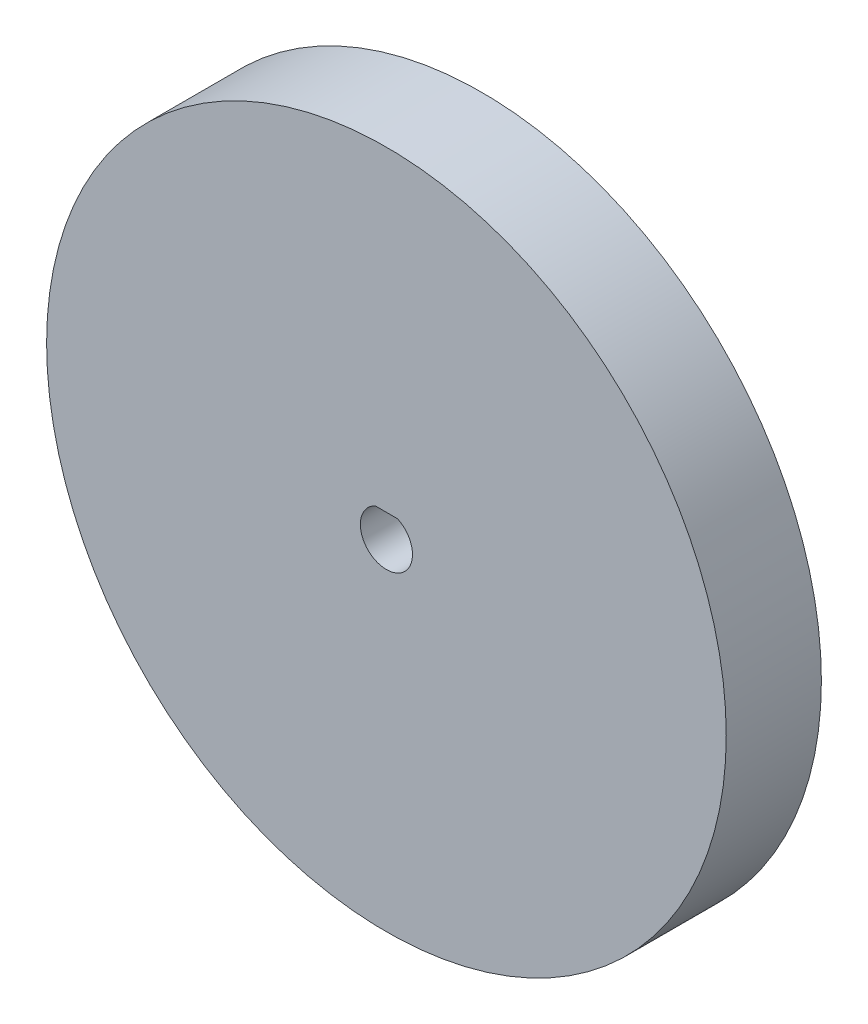
ISO-10303-21;
HEADER;
FILE_DESCRIPTION(('STEP AP214'),'2;1');
FILE_NAME('part.step','',(''),(''),'','','');
FILE_SCHEMA(('AUTOMOTIVE_DESIGN { 1 0 10303 214 1 1 1 1 }'));
ENDSEC;
DATA;
#1=APPLICATION_CONTEXT('core data for automotive mechanical design processes');
#2=APPLICATION_PROTOCOL_DEFINITION('international standard','automotive_design',2000,#1);
#3=PRODUCT_CONTEXT('',#1,'mechanical');
#4=PRODUCT('Part','Part','',(#3));
#5=PRODUCT_RELATED_PRODUCT_CATEGORY('part','',(#4));
#6=PRODUCT_DEFINITION_FORMATION('','',#4);
#7=PRODUCT_DEFINITION_CONTEXT('part definition',#1,'design');
#8=PRODUCT_DEFINITION('design','',#6,#7);
#9=PRODUCT_DEFINITION_SHAPE('','',#8);
#10=(LENGTH_UNIT() NAMED_UNIT(*) SI_UNIT(.MILLI.,.METRE.));
#11=(NAMED_UNIT(*) PLANE_ANGLE_UNIT() SI_UNIT($,.RADIAN.));
#12=(NAMED_UNIT(*) SI_UNIT($,.STERADIAN.) SOLID_ANGLE_UNIT());
#13=UNCERTAINTY_MEASURE_WITH_UNIT(LENGTH_MEASURE(1.E-05),#10,'distance_accuracy_value','');
#14=(GEOMETRIC_REPRESENTATION_CONTEXT(3) GLOBAL_UNCERTAINTY_ASSIGNED_CONTEXT((#13)) GLOBAL_UNIT_ASSIGNED_CONTEXT((#10,
#11,#12)) REPRESENTATION_CONTEXT('',''));
#15=CARTESIAN_POINT('',(0.,0.,0.));
#16=DIRECTION('',(0.,0.,1.));
#17=DIRECTION('',(1.,0.,0.));
#18=AXIS2_PLACEMENT_3D('',#15,#16,#17);
#19=CARTESIAN_POINT('',(0.,0.,5.334));
#20=DIRECTION('',(0.,0.,-1.));
#21=DIRECTION('',(-1.,0.,0.));
#22=AXIS2_PLACEMENT_3D('',#19,#20,#21);
#23=CYLINDRICAL_SURFACE('',#22,38.1);
#24=CARTESIAN_POINT('',(0.,0.,5.334));
#25=DIRECTION('',(0.,0.,1.));
#26=DIRECTION('',(1.,0.,0.));
#27=AXIS2_PLACEMENT_3D('',#24,#25,#26);
#28=CIRCLE('',#27,38.1);
#29=CARTESIAN_POINT('',(38.1,0.,5.334));
#30=VERTEX_POINT('',#29);
#31=EDGE_CURVE('E11',#30,#30,#28,.T.);
#32=ORIENTED_EDGE('',*,*,#31,.F.);
#33=EDGE_LOOP('',(#32));
#34=FACE_BOUND('',#33,.T.);
#35=CARTESIAN_POINT('',(0.,0.,-5.334));
#36=DIRECTION('',(0.,0.,1.));
#37=DIRECTION('',(1.,0.,0.));
#38=AXIS2_PLACEMENT_3D('',#35,#36,#37);
#39=CIRCLE('',#38,38.1);
#40=CARTESIAN_POINT('',(38.1,0.,-5.334));
#41=VERTEX_POINT('',#40);
#42=EDGE_CURVE('E35',#41,#41,#39,.T.);
#43=ORIENTED_EDGE('',*,*,#42,.T.);
#44=EDGE_LOOP('',(#43));
#45=FACE_BOUND('',#44,.T.);
#46=ADVANCED_FACE('F32',(#34,#45),#23,.T.);
#47=CARTESIAN_POINT('',(0.,0.,5.334));
#48=DIRECTION('',(0.,0.,1.));
#49=DIRECTION('',(1.,0.,0.));
#50=AXIS2_PLACEMENT_3D('',#47,#48,#49);
#51=PLANE('',#50);
#52=CARTESIAN_POINT('',(0.,0.,5.334));
#53=DIRECTION('',(0.,0.,-1.));
#54=DIRECTION('',(-1.,0.,0.));
#55=AXIS2_PLACEMENT_3D('',#52,#53,#54);
#56=CIRCLE('',#55,2.921);
#57=CARTESIAN_POINT('',(1.2573,2.63655792843624,5.334));
#58=VERTEX_POINT('',#57);
#59=CARTESIAN_POINT('',(-1.2573,2.63655792843624,5.334));
#60=VERTEX_POINT('',#59);
#61=EDGE_CURVE('E46',#58,#60,#56,.T.);
#62=ORIENTED_EDGE('',*,*,#61,.T.);
#63=DIRECTION('',(1.,0.,0.));
#64=VECTOR('',#63,1.);
#65=CARTESIAN_POINT('',(1.2573,2.63655792843624,5.334));
#66=LINE('',#65,#64);
#67=EDGE_CURVE('E73',#60,#58,#66,.T.);
#68=ORIENTED_EDGE('',*,*,#67,.T.);
#69=EDGE_LOOP('',(#62,#68));
#70=FACE_BOUND('',#69,.T.);
#71=ORIENTED_EDGE('',*,*,#31,.T.);
#72=EDGE_LOOP('',(#71));
#73=FACE_BOUND('',#72,.T.);
#74=ADVANCED_FACE('F77',(#70,#73),#51,.T.);
#75=CARTESIAN_POINT('',(0.,0.,-5.334));
#76=DIRECTION('',(0.,0.,1.));
#77=DIRECTION('',(1.,0.,0.));
#78=AXIS2_PLACEMENT_3D('',#75,#76,#77);
#79=PLANE('',#78);
#80=DIRECTION('',(1.,0.,0.));
#81=VECTOR('',#80,1.);
#82=CARTESIAN_POINT('',(1.2573,2.63655792843624,-5.334));
#83=LINE('',#82,#81);
#84=CARTESIAN_POINT('',(-1.2573,2.63655792843624,-5.334));
#85=VERTEX_POINT('',#84);
#86=CARTESIAN_POINT('',(1.2573,2.63655792843624,-5.334));
#87=VERTEX_POINT('',#86);
#88=EDGE_CURVE('E65',#85,#87,#83,.T.);
#89=ORIENTED_EDGE('',*,*,#88,.F.);
#90=CARTESIAN_POINT('',(0.,0.,-5.334));
#91=DIRECTION('',(0.,0.,-1.));
#92=DIRECTION('',(-1.,0.,0.));
#93=AXIS2_PLACEMENT_3D('',#90,#91,#92);
#94=CIRCLE('',#93,2.921);
#95=EDGE_CURVE('E51',#87,#85,#94,.T.);
#96=ORIENTED_EDGE('',*,*,#95,.F.);
#97=EDGE_LOOP('',(#89,#96));
#98=FACE_BOUND('',#97,.T.);
#99=ORIENTED_EDGE('',*,*,#42,.F.);
#100=EDGE_LOOP('',(#99));
#101=FACE_BOUND('',#100,.T.);
#102=ADVANCED_FACE('F69',(#98,#101),#79,.F.);
#103=CARTESIAN_POINT('',(0.,0.,5.334));
#104=DIRECTION('',(0.,0.,-1.));
#105=DIRECTION('',(-1.,0.,0.));
#106=AXIS2_PLACEMENT_3D('',#103,#104,#105);
#107=CYLINDRICAL_SURFACE('',#106,2.921);
#108=ORIENTED_EDGE('',*,*,#95,.T.);
#109=DIRECTION('',(0.,0.,-1.));
#110=VECTOR('',#109,1.);
#111=CARTESIAN_POINT('',(-1.2573,2.63655792843624,5.334));
#112=LINE('',#111,#110);
#113=EDGE_CURVE('E62',#60,#85,#112,.T.);
#114=ORIENTED_EDGE('',*,*,#113,.F.);
#115=ORIENTED_EDGE('',*,*,#61,.F.);
#116=DIRECTION('',(0.,0.,-1.));
#117=VECTOR('',#116,1.);
#118=CARTESIAN_POINT('',(1.2573,2.63655792843624,5.334));
#119=LINE('',#118,#117);
#120=EDGE_CURVE('E56',#58,#87,#119,.T.);
#121=ORIENTED_EDGE('',*,*,#120,.T.);
#122=EDGE_LOOP('',(#108,#114,#115,#121));
#123=FACE_BOUND('',#122,.T.);
#124=ADVANCED_FACE('F58',(#123),#107,.F.);
#125=CARTESIAN_POINT('',(1.2573,2.63655792843624,5.334));
#126=DIRECTION('',(0.,1.,0.));
#127=DIRECTION('',(0.,0.,1.));
#128=AXIS2_PLACEMENT_3D('',#125,#126,#127);
#129=PLANE('',#128);
#130=ORIENTED_EDGE('',*,*,#88,.T.);
#131=ORIENTED_EDGE('',*,*,#120,.F.);
#132=ORIENTED_EDGE('',*,*,#67,.F.);
#133=ORIENTED_EDGE('',*,*,#113,.T.);
#134=EDGE_LOOP('',(#130,#131,#132,#133));
#135=FACE_BOUND('',#134,.T.);
#136=ADVANCED_FACE('F66',(#135),#129,.F.);
#137=CLOSED_SHELL('',(#46,#74,#102,#124,#136));
#138=MANIFOLD_SOLID_BREP('B2',#137);
#139=ADVANCED_BREP_SHAPE_REPRESENTATION('',(#18,#138),#14);
#140=SHAPE_DEFINITION_REPRESENTATION(#9,#139);
ENDSEC;
END-ISO-10303-21;
